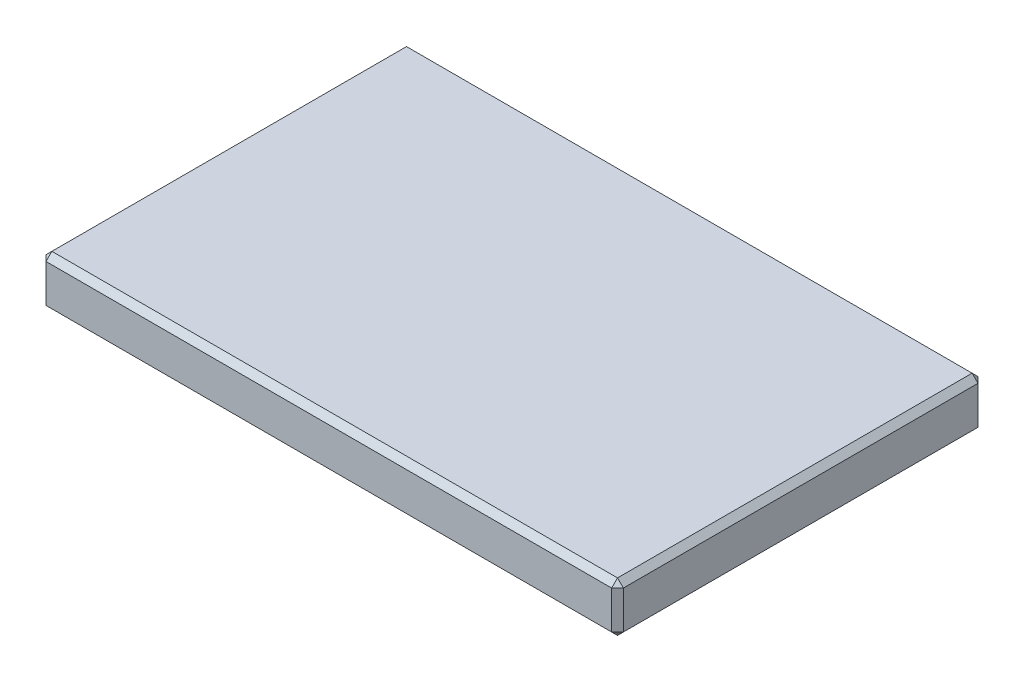
ISO-10303-21;
HEADER;
FILE_DESCRIPTION(('STEP AP214'),'2;1');
FILE_NAME('part.step','',(''),(''),'','','');
FILE_SCHEMA(('AUTOMOTIVE_DESIGN { 1 0 10303 214 1 1 1 1 }'));
ENDSEC;
DATA;
#1=APPLICATION_CONTEXT('core data for automotive mechanical design processes');
#2=APPLICATION_PROTOCOL_DEFINITION('international standard','automotive_design',2000,#1);
#3=PRODUCT_CONTEXT('',#1,'mechanical');
#4=PRODUCT('Part','Part','',(#3));
#5=PRODUCT_RELATED_PRODUCT_CATEGORY('part','',(#4));
#6=PRODUCT_DEFINITION_FORMATION('','',#4);
#7=PRODUCT_DEFINITION_CONTEXT('part definition',#1,'design');
#8=PRODUCT_DEFINITION('design','',#6,#7);
#9=PRODUCT_DEFINITION_SHAPE('','',#8);
#10=(LENGTH_UNIT() NAMED_UNIT(*) SI_UNIT(.MILLI.,.METRE.));
#11=(NAMED_UNIT(*) PLANE_ANGLE_UNIT() SI_UNIT($,.RADIAN.));
#12=(NAMED_UNIT(*) SI_UNIT($,.STERADIAN.) SOLID_ANGLE_UNIT());
#13=UNCERTAINTY_MEASURE_WITH_UNIT(LENGTH_MEASURE(1.E-05),#10,'distance_accuracy_value','');
#14=(GEOMETRIC_REPRESENTATION_CONTEXT(3) GLOBAL_UNCERTAINTY_ASSIGNED_CONTEXT((#13)) GLOBAL_UNIT_ASSIGNED_CONTEXT((#10,
#11,#12)) REPRESENTATION_CONTEXT('',''));
#15=CARTESIAN_POINT('',(0.,0.,0.));
#16=DIRECTION('',(0.,0.,1.));
#17=DIRECTION('',(1.,0.,0.));
#18=AXIS2_PLACEMENT_3D('',#15,#16,#17);
#19=CARTESIAN_POINT('',(98.5,17.,62.5));
#20=DIRECTION('',(-1.,0.,0.));
#21=DIRECTION('',(0.,0.,1.));
#22=AXIS2_PLACEMENT_3D('',#19,#20,#21);
#23=PLANE('',#22);
#24=DIRECTION('',(0.,0.,-1.));
#25=VECTOR('',#24,1.);
#26=CARTESIAN_POINT('',(98.5,1.99999999999997,-62.5));
#27=LINE('',#26,#25);
#28=CARTESIAN_POINT('',(98.5,1.99999999999997,60.5));
#29=VERTEX_POINT('',#28);
#30=CARTESIAN_POINT('',(98.5,1.99999999999997,-60.5));
#31=VERTEX_POINT('',#30);
#32=EDGE_CURVE('E160',#29,#31,#27,.T.);
#33=ORIENTED_EDGE('',*,*,#32,.T.);
#34=DIRECTION('',(0.,1.,0.));
#35=VECTOR('',#34,1.);
#36=CARTESIAN_POINT('',(98.5,17.,-60.5));
#37=LINE('',#36,#35);
#38=CARTESIAN_POINT('',(98.5,15.,-60.5));
#39=VERTEX_POINT('',#38);
#40=EDGE_CURVE('E131',#31,#39,#37,.T.);
#41=ORIENTED_EDGE('',*,*,#40,.T.);
#42=DIRECTION('',(0.,0.,1.));
#43=VECTOR('',#42,1.);
#44=CARTESIAN_POINT('',(98.5,15.,62.5));
#45=LINE('',#44,#43);
#46=CARTESIAN_POINT('',(98.5,15.,60.5));
#47=VERTEX_POINT('',#46);
#48=EDGE_CURVE('E167',#39,#47,#45,.T.);
#49=ORIENTED_EDGE('',*,*,#48,.T.);
#50=DIRECTION('',(0.,-1.,0.));
#51=VECTOR('',#50,1.);
#52=CARTESIAN_POINT('',(98.5,17.,60.5));
#53=LINE('',#52,#51);
#54=EDGE_CURVE('E165',#47,#29,#53,.T.);
#55=ORIENTED_EDGE('',*,*,#54,.T.);
#56=EDGE_LOOP('',(#33,#41,#49,#55));
#57=FACE_BOUND('',#56,.T.);
#58=ADVANCED_FACE('F35',(#57),#23,.F.);
#59=CARTESIAN_POINT('',(-98.5,17.,-62.5));
#60=DIRECTION('',(0.,0.,1.));
#61=DIRECTION('',(1.,0.,0.));
#62=AXIS2_PLACEMENT_3D('',#59,#60,#61);
#63=PLANE('',#62);
#64=DIRECTION('',(0.,1.,0.));
#65=VECTOR('',#64,1.);
#66=CARTESIAN_POINT('',(-96.5,17.,-62.5));
#67=LINE('',#66,#65);
#68=CARTESIAN_POINT('',(-96.5,1.99999999999997,-62.5));
#69=VERTEX_POINT('',#68);
#70=CARTESIAN_POINT('',(-96.5,15.,-62.5));
#71=VERTEX_POINT('',#70);
#72=EDGE_CURVE('E153',#69,#71,#67,.T.);
#73=ORIENTED_EDGE('',*,*,#72,.T.);
#74=DIRECTION('',(1.,0.,0.));
#75=VECTOR('',#74,1.);
#76=CARTESIAN_POINT('',(-98.5,15.,-62.5));
#77=LINE('',#76,#75);
#78=CARTESIAN_POINT('',(96.5,15.,-62.5));
#79=VERTEX_POINT('',#78);
#80=EDGE_CURVE('E157',#71,#79,#77,.T.);
#81=ORIENTED_EDGE('',*,*,#80,.T.);
#82=DIRECTION('',(0.,-1.,0.));
#83=VECTOR('',#82,1.);
#84=CARTESIAN_POINT('',(96.5,17.,-62.5));
#85=LINE('',#84,#83);
#86=CARTESIAN_POINT('',(96.5,1.99999999999997,-62.5));
#87=VERTEX_POINT('',#86);
#88=EDGE_CURVE('E129',#79,#87,#85,.T.);
#89=ORIENTED_EDGE('',*,*,#88,.T.);
#90=DIRECTION('',(-1.,0.,0.));
#91=VECTOR('',#90,1.);
#92=CARTESIAN_POINT('',(-98.5,1.99999999999997,-62.5));
#93=LINE('',#92,#91);
#94=EDGE_CURVE('E147',#87,#69,#93,.T.);
#95=ORIENTED_EDGE('',*,*,#94,.T.);
#96=EDGE_LOOP('',(#73,#81,#89,#95));
#97=FACE_BOUND('',#96,.T.);
#98=ADVANCED_FACE('F155',(#97),#63,.F.);
#99=CARTESIAN_POINT('',(-98.5,17.,62.5));
#100=DIRECTION('',(1.,0.,0.));
#101=DIRECTION('',(0.,0.,-1.));
#102=AXIS2_PLACEMENT_3D('',#99,#100,#101);
#103=PLANE('',#102);
#104=DIRECTION('',(0.,1.,0.));
#105=VECTOR('',#104,1.);
#106=CARTESIAN_POINT('',(-98.5,17.,60.5));
#107=LINE('',#106,#105);
#108=CARTESIAN_POINT('',(-98.5,1.99999999999997,60.5));
#109=VERTEX_POINT('',#108);
#110=CARTESIAN_POINT('',(-98.5,15.,60.5));
#111=VERTEX_POINT('',#110);
#112=EDGE_CURVE('E172',#109,#111,#107,.T.);
#113=ORIENTED_EDGE('',*,*,#112,.T.);
#114=DIRECTION('',(0.,0.,-1.));
#115=VECTOR('',#114,1.);
#116=CARTESIAN_POINT('',(-98.5,15.,62.5));
#117=LINE('',#116,#115);
#118=CARTESIAN_POINT('',(-98.5,15.,-60.5));
#119=VERTEX_POINT('',#118);
#120=EDGE_CURVE('E177',#111,#119,#117,.T.);
#121=ORIENTED_EDGE('',*,*,#120,.T.);
#122=DIRECTION('',(0.,-1.,0.));
#123=VECTOR('',#122,1.);
#124=CARTESIAN_POINT('',(-98.5,17.,-60.5));
#125=LINE('',#124,#123);
#126=CARTESIAN_POINT('',(-98.5,1.99999999999997,-60.5));
#127=VERTEX_POINT('',#126);
#128=EDGE_CURVE('E174',#119,#127,#125,.T.);
#129=ORIENTED_EDGE('',*,*,#128,.T.);
#130=DIRECTION('',(0.,0.,1.));
#131=VECTOR('',#130,1.);
#132=CARTESIAN_POINT('',(-98.5,1.99999999999997,62.5));
#133=LINE('',#132,#131);
#134=EDGE_CURVE('E170',#127,#109,#133,.T.);
#135=ORIENTED_EDGE('',*,*,#134,.T.);
#136=EDGE_LOOP('',(#113,#121,#129,#135));
#137=FACE_BOUND('',#136,.T.);
#138=ADVANCED_FACE('F282',(#137),#103,.F.);
#139=CARTESIAN_POINT('',(-98.5,17.,62.5));
#140=DIRECTION('',(0.,0.,-1.));
#141=DIRECTION('',(-1.,0.,0.));
#142=AXIS2_PLACEMENT_3D('',#139,#140,#141);
#143=PLANE('',#142);
#144=DIRECTION('',(-1.,0.,0.));
#145=VECTOR('',#144,1.);
#146=CARTESIAN_POINT('',(-98.5,15.,62.5));
#147=LINE('',#146,#145);
#148=CARTESIAN_POINT('',(96.5,15.,62.5));
#149=VERTEX_POINT('',#148);
#150=CARTESIAN_POINT('',(-96.5,15.,62.5));
#151=VERTEX_POINT('',#150);
#152=EDGE_CURVE('E183',#149,#151,#147,.T.);
#153=ORIENTED_EDGE('',*,*,#152,.T.);
#154=DIRECTION('',(0.,-1.,0.));
#155=VECTOR('',#154,1.);
#156=CARTESIAN_POINT('',(-96.5,17.,62.5));
#157=LINE('',#156,#155);
#158=CARTESIAN_POINT('',(-96.5,1.99999999999997,62.5));
#159=VERTEX_POINT('',#158);
#160=EDGE_CURVE('E185',#151,#159,#157,.T.);
#161=ORIENTED_EDGE('',*,*,#160,.T.);
#162=DIRECTION('',(1.,0.,0.));
#163=VECTOR('',#162,1.);
#164=CARTESIAN_POINT('',(98.5,1.99999999999997,62.5));
#165=LINE('',#164,#163);
#166=CARTESIAN_POINT('',(96.5,1.99999999999997,62.5));
#167=VERTEX_POINT('',#166);
#168=EDGE_CURVE('E179',#159,#167,#165,.T.);
#169=ORIENTED_EDGE('',*,*,#168,.T.);
#170=DIRECTION('',(0.,1.,0.));
#171=VECTOR('',#170,1.);
#172=CARTESIAN_POINT('',(96.5,17.,62.5));
#173=LINE('',#172,#171);
#174=EDGE_CURVE('E181',#167,#149,#173,.T.);
#175=ORIENTED_EDGE('',*,*,#174,.T.);
#176=EDGE_LOOP('',(#153,#161,#169,#175));
#177=FACE_BOUND('',#176,.T.);
#178=ADVANCED_FACE('F292',(#177),#143,.F.);
#179=CARTESIAN_POINT('',(0.,17.,0.));
#180=DIRECTION('',(0.,-1.,0.));
#181=DIRECTION('',(0.,0.,-1.));
#182=AXIS2_PLACEMENT_3D('',#179,#180,#181);
#183=PLANE('',#182);
#184=DIRECTION('',(0.,0.,1.));
#185=VECTOR('',#184,1.);
#186=CARTESIAN_POINT('',(-96.5,17.,0.));
#187=LINE('',#186,#185);
#188=CARTESIAN_POINT('',(-96.5,17.,-60.5));
#189=VERTEX_POINT('',#188);
#190=CARTESIAN_POINT('',(-96.5,17.,60.5));
#191=VERTEX_POINT('',#190);
#192=EDGE_CURVE('E192',#189,#191,#187,.T.);
#193=ORIENTED_EDGE('',*,*,#192,.T.);
#194=DIRECTION('',(1.,0.,0.));
#195=VECTOR('',#194,1.);
#196=CARTESIAN_POINT('',(0.,17.,60.5));
#197=LINE('',#196,#195);
#198=CARTESIAN_POINT('',(96.5,17.,60.5));
#199=VERTEX_POINT('',#198);
#200=EDGE_CURVE('E194',#191,#199,#197,.T.);
#201=ORIENTED_EDGE('',*,*,#200,.T.);
#202=DIRECTION('',(0.,0.,-1.));
#203=VECTOR('',#202,1.);
#204=CARTESIAN_POINT('',(96.5,17.,0.));
#205=LINE('',#204,#203);
#206=CARTESIAN_POINT('',(96.5,17.,-60.5));
#207=VERTEX_POINT('',#206);
#208=EDGE_CURVE('E188',#199,#207,#205,.T.);
#209=ORIENTED_EDGE('',*,*,#208,.T.);
#210=DIRECTION('',(-1.,0.,0.));
#211=VECTOR('',#210,1.);
#212=CARTESIAN_POINT('',(0.,17.,-60.5));
#213=LINE('',#212,#211);
#214=EDGE_CURVE('E190',#207,#189,#213,.T.);
#215=ORIENTED_EDGE('',*,*,#214,.T.);
#216=EDGE_LOOP('',(#193,#201,#209,#215));
#217=FACE_BOUND('',#216,.T.);
#218=ADVANCED_FACE('F274',(#217),#183,.F.);
#219=CARTESIAN_POINT('',(0.,0.,0.));
#220=DIRECTION('',(0.,-1.,0.));
#221=DIRECTION('',(0.,0.,-1.));
#222=AXIS2_PLACEMENT_3D('',#219,#220,#221);
#223=PLANE('',#222);
#224=DIRECTION('',(0.,0.,1.));
#225=VECTOR('',#224,1.);
#226=CARTESIAN_POINT('',(96.5,0.,62.5));
#227=LINE('',#226,#225);
#228=CARTESIAN_POINT('',(96.5,0.,-60.5));
#229=VERTEX_POINT('',#228);
#230=CARTESIAN_POINT('',(96.5,0.,60.5));
#231=VERTEX_POINT('',#230);
#232=EDGE_CURVE('E197',#229,#231,#227,.T.);
#233=ORIENTED_EDGE('',*,*,#232,.T.);
#234=DIRECTION('',(-1.,0.,0.));
#235=VECTOR('',#234,1.);
#236=CARTESIAN_POINT('',(-98.5,0.,60.5));
#237=LINE('',#236,#235);
#238=CARTESIAN_POINT('',(-96.5,0.,60.5));
#239=VERTEX_POINT('',#238);
#240=EDGE_CURVE('E11',#231,#239,#237,.T.);
#241=ORIENTED_EDGE('',*,*,#240,.T.);
#242=DIRECTION('',(0.,0.,-1.));
#243=VECTOR('',#242,1.);
#244=CARTESIAN_POINT('',(-96.5,0.,-62.5));
#245=LINE('',#244,#243);
#246=CARTESIAN_POINT('',(-96.5,0.,-60.5));
#247=VERTEX_POINT('',#246);
#248=EDGE_CURVE('E45',#239,#247,#245,.T.);
#249=ORIENTED_EDGE('',*,*,#248,.T.);
#250=DIRECTION('',(1.,0.,0.));
#251=VECTOR('',#250,1.);
#252=CARTESIAN_POINT('',(98.5,0.,-60.5));
#253=LINE('',#252,#251);
#254=EDGE_CURVE('E199',#247,#229,#253,.T.);
#255=ORIENTED_EDGE('',*,*,#254,.T.);
#256=EDGE_LOOP('',(#233,#241,#249,#255));
#257=FACE_BOUND('',#256,.T.);
#258=ADVANCED_FACE('F428',(#257),#223,.T.);
#259=CARTESIAN_POINT('',(-96.5,17.,62.5));
#260=DIRECTION('',(0.707106781186547,0.,-0.707106781186547));
#261=DIRECTION('',(0.,-1.,0.));
#262=AXIS2_PLACEMENT_3D('',#259,#260,#261);
#263=PLANE('',#262);
#264=DIRECTION('',(-0.707106781186547,0.,-0.707106781186547));
#265=VECTOR('',#264,1.);
#266=CARTESIAN_POINT('',(-98.5,15.,60.5));
#267=LINE('',#266,#265);
#268=EDGE_CURVE('E40',#111,#151,#267,.F.);
#269=ORIENTED_EDGE('',*,*,#268,.F.);
#270=ORIENTED_EDGE('',*,*,#112,.F.);
#271=DIRECTION('',(0.707106781186547,0.,0.707106781186547));
#272=VECTOR('',#271,1.);
#273=CARTESIAN_POINT('',(-96.5,1.99999999999997,62.5));
#274=LINE('',#273,#272);
#275=EDGE_CURVE('E252',#159,#109,#274,.F.);
#276=ORIENTED_EDGE('',*,*,#275,.F.);
#277=ORIENTED_EDGE('',*,*,#160,.F.);
#278=EDGE_LOOP('',(#269,#270,#276,#277));
#279=FACE_BOUND('',#278,.T.);
#280=ADVANCED_FACE('F38',(#279),#263,.F.);
#281=CARTESIAN_POINT('',(-98.5,15.,60.5));
#282=DIRECTION('',(-0.577350269189626,0.577350269189626,0.577350269189626));
#283=DIRECTION('',(0.707106781186547,0.,0.707106781186547));
#284=AXIS2_PLACEMENT_3D('',#281,#282,#283);
#285=PLANE('',#284);
#286=DIRECTION('',(0.707106781186547,0.707106781186547,0.));
#287=VECTOR('',#286,1.);
#288=CARTESIAN_POINT('',(-98.5,15.,60.5));
#289=LINE('',#288,#287);
#290=EDGE_CURVE('E247',#111,#191,#289,.T.);
#291=ORIENTED_EDGE('',*,*,#290,.F.);
#292=ORIENTED_EDGE('',*,*,#268,.T.);
#293=DIRECTION('',(0.,-0.707106781186547,0.707106781186547));
#294=VECTOR('',#293,1.);
#295=CARTESIAN_POINT('',(-96.5,16.,61.5));
#296=LINE('',#295,#294);
#297=EDGE_CURVE('E250',#191,#151,#296,.T.);
#298=ORIENTED_EDGE('',*,*,#297,.F.);
#299=EDGE_LOOP('',(#291,#292,#298));
#300=FACE_BOUND('',#299,.T.);
#301=ADVANCED_FACE('F262',(#300),#285,.T.);
#302=CARTESIAN_POINT('',(-96.5,1.99999999999997,62.5));
#303=DIRECTION('',(-0.577350269189626,-0.577350269189626,0.577350269189626));
#304=DIRECTION('',(0.707106781186547,0.,0.707106781186547));
#305=AXIS2_PLACEMENT_3D('',#302,#303,#304);
#306=PLANE('',#305);
#307=DIRECTION('',(0.,0.707106781186547,0.707106781186547));
#308=VECTOR('',#307,1.);
#309=CARTESIAN_POINT('',(-96.5,1.99999999999997,62.5));
#310=LINE('',#309,#308);
#311=EDGE_CURVE('E242',#159,#239,#310,.F.);
#312=ORIENTED_EDGE('',*,*,#311,.F.);
#313=ORIENTED_EDGE('',*,*,#275,.T.);
#314=DIRECTION('',(0.707106781186547,-0.707106781186547,0.));
#315=VECTOR('',#314,1.);
#316=CARTESIAN_POINT('',(-97.5,0.999999999999987,60.5));
#317=LINE('',#316,#315);
#318=EDGE_CURVE('E245',#239,#109,#317,.F.);
#319=ORIENTED_EDGE('',*,*,#318,.F.);
#320=EDGE_LOOP('',(#312,#313,#319));
#321=FACE_BOUND('',#320,.T.);
#322=ADVANCED_FACE('F418',(#321),#306,.T.);
#323=CARTESIAN_POINT('',(0.,17.,60.5));
#324=DIRECTION('',(0.,-0.707106781186547,-0.707106781186547));
#325=DIRECTION('',(1.,0.,0.));
#326=AXIS2_PLACEMENT_3D('',#323,#324,#325);
#327=PLANE('',#326);
#328=ORIENTED_EDGE('',*,*,#297,.T.);
#329=ORIENTED_EDGE('',*,*,#152,.F.);
#330=DIRECTION('',(0.,0.707106781186547,-0.707106781186547));
#331=VECTOR('',#330,1.);
#332=CARTESIAN_POINT('',(96.5,17.,60.5));
#333=LINE('',#332,#331);
#334=EDGE_CURVE('E236',#199,#149,#333,.F.);
#335=ORIENTED_EDGE('',*,*,#334,.F.);
#336=ORIENTED_EDGE('',*,*,#200,.F.);
#337=EDGE_LOOP('',(#328,#329,#335,#336));
#338=FACE_BOUND('',#337,.T.);
#339=ADVANCED_FACE('F270',(#338),#327,.F.);
#340=CARTESIAN_POINT('',(-96.5,17.,0.));
#341=DIRECTION('',(0.707106781186547,-0.707106781186547,0.));
#342=DIRECTION('',(0.,0.,1.));
#343=AXIS2_PLACEMENT_3D('',#340,#341,#342);
#344=PLANE('',#343);
#345=ORIENTED_EDGE('',*,*,#290,.T.);
#346=ORIENTED_EDGE('',*,*,#192,.F.);
#347=DIRECTION('',(-0.707106781186547,-0.707106781186547,0.));
#348=VECTOR('',#347,1.);
#349=CARTESIAN_POINT('',(-97.5,16.,-60.5));
#350=LINE('',#349,#348);
#351=EDGE_CURVE('E233',#119,#189,#350,.F.);
#352=ORIENTED_EDGE('',*,*,#351,.F.);
#353=ORIENTED_EDGE('',*,*,#120,.F.);
#354=EDGE_LOOP('',(#345,#346,#352,#353));
#355=FACE_BOUND('',#354,.T.);
#356=ADVANCED_FACE('F279',(#355),#344,.F.);
#357=CARTESIAN_POINT('',(-98.5,17.,-60.5));
#358=DIRECTION('',(0.707106781186547,0.,0.707106781186547));
#359=DIRECTION('',(0.,-1.,0.));
#360=AXIS2_PLACEMENT_3D('',#357,#358,#359);
#361=PLANE('',#360);
#362=DIRECTION('',(-0.707106781186547,0.,0.707106781186547));
#363=VECTOR('',#362,1.);
#364=CARTESIAN_POINT('',(-98.5,1.99999999999997,-60.5));
#365=LINE('',#364,#363);
#366=EDGE_CURVE('E227',#127,#69,#365,.F.);
#367=ORIENTED_EDGE('',*,*,#366,.F.);
#368=ORIENTED_EDGE('',*,*,#128,.F.);
#369=DIRECTION('',(0.707106781186547,0.,-0.707106781186547));
#370=VECTOR('',#369,1.);
#371=CARTESIAN_POINT('',(-96.5,15.,-62.5));
#372=LINE('',#371,#370);
#373=EDGE_CURVE('E230',#71,#119,#372,.F.);
#374=ORIENTED_EDGE('',*,*,#373,.F.);
#375=ORIENTED_EDGE('',*,*,#72,.F.);
#376=EDGE_LOOP('',(#367,#368,#374,#375));
#377=FACE_BOUND('',#376,.T.);
#378=ADVANCED_FACE('F286',(#377),#361,.F.);
#379=CARTESIAN_POINT('',(-98.5,1.99999999999997,62.5));
#380=DIRECTION('',(-0.707106781186547,-0.707106781186547,0.));
#381=DIRECTION('',(0.,0.,-1.));
#382=AXIS2_PLACEMENT_3D('',#379,#380,#381);
#383=PLANE('',#382);
#384=ORIENTED_EDGE('',*,*,#318,.T.);
#385=ORIENTED_EDGE('',*,*,#134,.F.);
#386=DIRECTION('',(-0.707106781186547,0.707106781186547,0.));
#387=VECTOR('',#386,1.);
#388=CARTESIAN_POINT('',(-98.5,1.99999999999997,-60.5));
#389=LINE('',#388,#387);
#390=EDGE_CURVE('E225',#247,#127,#389,.T.);
#391=ORIENTED_EDGE('',*,*,#390,.F.);
#392=ORIENTED_EDGE('',*,*,#248,.F.);
#393=EDGE_LOOP('',(#384,#385,#391,#392));
#394=FACE_BOUND('',#393,.T.);
#395=ADVANCED_FACE('F290',(#394),#383,.T.);
#396=CARTESIAN_POINT('',(-98.5,1.99999999999997,62.5));
#397=DIRECTION('',(0.,-0.707106781186547,0.707106781186547));
#398=DIRECTION('',(-1.,0.,0.));
#399=AXIS2_PLACEMENT_3D('',#396,#397,#398);
#400=PLANE('',#399);
#401=ORIENTED_EDGE('',*,*,#311,.T.);
#402=ORIENTED_EDGE('',*,*,#240,.F.);
#403=DIRECTION('',(0.,-0.707106781186547,-0.707106781186547));
#404=VECTOR('',#403,1.);
#405=CARTESIAN_POINT('',(96.5,0.999999999999987,61.5));
#406=LINE('',#405,#404);
#407=EDGE_CURVE('E222',#167,#231,#406,.T.);
#408=ORIENTED_EDGE('',*,*,#407,.F.);
#409=ORIENTED_EDGE('',*,*,#168,.F.);
#410=EDGE_LOOP('',(#401,#402,#408,#409));
#411=FACE_BOUND('',#410,.T.);
#412=ADVANCED_FACE('F302',(#411),#400,.T.);
#413=CARTESIAN_POINT('',(98.5,17.,60.5));
#414=DIRECTION('',(-0.707106781186547,0.,-0.707106781186547));
#415=DIRECTION('',(0.,-1.,0.));
#416=AXIS2_PLACEMENT_3D('',#413,#414,#415);
#417=PLANE('',#416);
#418=DIRECTION('',(-0.707106781186547,0.,0.707106781186547));
#419=VECTOR('',#418,1.);
#420=CARTESIAN_POINT('',(97.5,15.,61.5));
#421=LINE('',#420,#419);
#422=EDGE_CURVE('E239',#149,#47,#421,.F.);
#423=ORIENTED_EDGE('',*,*,#422,.F.);
#424=ORIENTED_EDGE('',*,*,#174,.F.);
#425=DIRECTION('',(0.707106781186547,0.,-0.707106781186547));
#426=VECTOR('',#425,1.);
#427=CARTESIAN_POINT('',(98.5,1.99999999999997,60.5));
#428=LINE('',#427,#426);
#429=EDGE_CURVE('E219',#29,#167,#428,.F.);
#430=ORIENTED_EDGE('',*,*,#429,.F.);
#431=ORIENTED_EDGE('',*,*,#54,.F.);
#432=EDGE_LOOP('',(#423,#424,#430,#431));
#433=FACE_BOUND('',#432,.T.);
#434=ADVANCED_FACE('F297',(#433),#417,.F.);
#435=CARTESIAN_POINT('',(96.5,17.,60.5));
#436=DIRECTION('',(0.577350269189626,0.577350269189626,0.577350269189626));
#437=DIRECTION('',(0.707106781186547,0.,-0.707106781186547));
#438=AXIS2_PLACEMENT_3D('',#435,#436,#437);
#439=PLANE('',#438);
#440=ORIENTED_EDGE('',*,*,#334,.T.);
#441=ORIENTED_EDGE('',*,*,#422,.T.);
#442=DIRECTION('',(0.707106781186547,-0.707106781186547,0.));
#443=VECTOR('',#442,1.);
#444=CARTESIAN_POINT('',(96.5,17.,60.5));
#445=LINE('',#444,#443);
#446=EDGE_CURVE('E216',#199,#47,#445,.T.);
#447=ORIENTED_EDGE('',*,*,#446,.F.);
#448=EDGE_LOOP('',(#440,#441,#447));
#449=FACE_BOUND('',#448,.T.);
#450=ADVANCED_FACE('F313',(#449),#439,.T.);
#451=CARTESIAN_POINT('',(-96.5,15.,-62.5));
#452=DIRECTION('',(-0.577350269189626,0.577350269189626,-0.577350269189626));
#453=DIRECTION('',(-0.707106781186547,0.,0.707106781186547));
#454=AXIS2_PLACEMENT_3D('',#451,#452,#453);
#455=PLANE('',#454);
#456=ORIENTED_EDGE('',*,*,#373,.T.);
#457=ORIENTED_EDGE('',*,*,#351,.T.);
#458=DIRECTION('',(0.,0.707106781186547,0.707106781186547));
#459=VECTOR('',#458,1.);
#460=CARTESIAN_POINT('',(-96.5,15.,-62.5));
#461=LINE('',#460,#459);
#462=EDGE_CURVE('E213',#71,#189,#461,.T.);
#463=ORIENTED_EDGE('',*,*,#462,.F.);
#464=EDGE_LOOP('',(#456,#457,#463));
#465=FACE_BOUND('',#464,.T.);
#466=ADVANCED_FACE('F323',(#465),#455,.T.);
#467=CARTESIAN_POINT('',(-98.5,1.99999999999997,-60.5));
#468=DIRECTION('',(-0.577350269189626,-0.577350269189626,-0.577350269189626));
#469=DIRECTION('',(-0.707106781186547,0.,0.707106781186547));
#470=AXIS2_PLACEMENT_3D('',#467,#468,#469);
#471=PLANE('',#470);
#472=ORIENTED_EDGE('',*,*,#390,.T.);
#473=ORIENTED_EDGE('',*,*,#366,.T.);
#474=DIRECTION('',(0.,-0.707106781186547,0.707106781186547));
#475=VECTOR('',#474,1.);
#476=CARTESIAN_POINT('',(-96.5,0.999999999999987,-61.5));
#477=LINE('',#476,#475);
#478=EDGE_CURVE('E150',#247,#69,#477,.F.);
#479=ORIENTED_EDGE('',*,*,#478,.F.);
#480=EDGE_LOOP('',(#472,#473,#479));
#481=FACE_BOUND('',#480,.T.);
#482=ADVANCED_FACE('F325',(#481),#471,.T.);
#483=CARTESIAN_POINT('',(98.5,1.99999999999997,60.5));
#484=DIRECTION('',(0.577350269189626,-0.577350269189626,0.577350269189626));
#485=DIRECTION('',(0.707106781186547,0.,-0.707106781186547));
#486=AXIS2_PLACEMENT_3D('',#483,#484,#485);
#487=PLANE('',#486);
#488=ORIENTED_EDGE('',*,*,#429,.T.);
#489=ORIENTED_EDGE('',*,*,#407,.T.);
#490=DIRECTION('',(0.707106781186547,0.707106781186547,0.));
#491=VECTOR('',#490,1.);
#492=CARTESIAN_POINT('',(98.5,1.99999999999997,60.5));
#493=LINE('',#492,#491);
#494=EDGE_CURVE('E209',#29,#231,#493,.F.);
#495=ORIENTED_EDGE('',*,*,#494,.F.);
#496=EDGE_LOOP('',(#488,#489,#495));
#497=FACE_BOUND('',#496,.T.);
#498=ADVANCED_FACE('F304',(#497),#487,.T.);
#499=CARTESIAN_POINT('',(96.5,17.,0.));
#500=DIRECTION('',(-0.707106781186547,-0.707106781186547,0.));
#501=DIRECTION('',(0.,0.,-1.));
#502=AXIS2_PLACEMENT_3D('',#499,#500,#501);
#503=PLANE('',#502);
#504=ORIENTED_EDGE('',*,*,#446,.T.);
#505=ORIENTED_EDGE('',*,*,#48,.F.);
#506=DIRECTION('',(-0.707106781186547,0.707106781186547,0.));
#507=VECTOR('',#506,1.);
#508=CARTESIAN_POINT('',(98.5,15.,-60.5));
#509=LINE('',#508,#507);
#510=EDGE_CURVE('E206',#207,#39,#509,.F.);
#511=ORIENTED_EDGE('',*,*,#510,.F.);
#512=ORIENTED_EDGE('',*,*,#208,.F.);
#513=EDGE_LOOP('',(#504,#505,#511,#512));
#514=FACE_BOUND('',#513,.T.);
#515=ADVANCED_FACE('F315',(#514),#503,.F.);
#516=CARTESIAN_POINT('',(0.,17.,-60.5));
#517=DIRECTION('',(0.,-0.707106781186547,0.707106781186547));
#518=DIRECTION('',(-1.,0.,0.));
#519=AXIS2_PLACEMENT_3D('',#516,#517,#518);
#520=PLANE('',#519);
#521=ORIENTED_EDGE('',*,*,#462,.T.);
#522=ORIENTED_EDGE('',*,*,#214,.F.);
#523=DIRECTION('',(0.,-0.707106781186547,-0.707106781186547));
#524=VECTOR('',#523,1.);
#525=CARTESIAN_POINT('',(96.5,16.,-61.5));
#526=LINE('',#525,#524);
#527=EDGE_CURVE('E144',#79,#207,#526,.F.);
#528=ORIENTED_EDGE('',*,*,#527,.F.);
#529=ORIENTED_EDGE('',*,*,#80,.F.);
#530=EDGE_LOOP('',(#521,#522,#528,#529));
#531=FACE_BOUND('',#530,.T.);
#532=ADVANCED_FACE('F321',(#531),#520,.F.);
#533=CARTESIAN_POINT('',(-98.5,1.99999999999997,-62.5));
#534=DIRECTION('',(0.,-0.707106781186547,-0.707106781186547));
#535=DIRECTION('',(1.,0.,0.));
#536=AXIS2_PLACEMENT_3D('',#533,#534,#535);
#537=PLANE('',#536);
#538=ORIENTED_EDGE('',*,*,#478,.T.);
#539=ORIENTED_EDGE('',*,*,#94,.F.);
#540=DIRECTION('',(0.,0.707106781186547,-0.707106781186547));
#541=VECTOR('',#540,1.);
#542=CARTESIAN_POINT('',(96.5,1.99999999999997,-62.5));
#543=LINE('',#542,#541);
#544=EDGE_CURVE('E137',#229,#87,#543,.T.);
#545=ORIENTED_EDGE('',*,*,#544,.F.);
#546=ORIENTED_EDGE('',*,*,#254,.F.);
#547=EDGE_LOOP('',(#538,#539,#545,#546));
#548=FACE_BOUND('',#547,.T.);
#549=ADVANCED_FACE('F148',(#548),#537,.T.);
#550=CARTESIAN_POINT('',(98.5,1.99999999999997,62.5));
#551=DIRECTION('',(0.707106781186547,-0.707106781186547,0.));
#552=DIRECTION('',(0.,0.,1.));
#553=AXIS2_PLACEMENT_3D('',#550,#551,#552);
#554=PLANE('',#553);
#555=ORIENTED_EDGE('',*,*,#494,.T.);
#556=ORIENTED_EDGE('',*,*,#232,.F.);
#557=DIRECTION('',(-0.707106781186547,-0.707106781186547,0.));
#558=VECTOR('',#557,1.);
#559=CARTESIAN_POINT('',(97.5,0.999999999999987,-60.5));
#560=LINE('',#559,#558);
#561=EDGE_CURVE('E141',#31,#229,#560,.T.);
#562=ORIENTED_EDGE('',*,*,#561,.F.);
#563=ORIENTED_EDGE('',*,*,#32,.F.);
#564=EDGE_LOOP('',(#555,#556,#562,#563));
#565=FACE_BOUND('',#564,.T.);
#566=ADVANCED_FACE('F308',(#565),#554,.T.);
#567=CARTESIAN_POINT('',(98.5,15.,-60.5));
#568=DIRECTION('',(0.577350269189626,0.577350269189626,-0.577350269189626));
#569=DIRECTION('',(-0.707106781186547,0.,-0.707106781186547));
#570=AXIS2_PLACEMENT_3D('',#567,#568,#569);
#571=PLANE('',#570);
#572=ORIENTED_EDGE('',*,*,#527,.T.);
#573=ORIENTED_EDGE('',*,*,#510,.T.);
#574=DIRECTION('',(0.707106781186547,0.,0.707106781186547));
#575=VECTOR('',#574,1.);
#576=CARTESIAN_POINT('',(98.5,15.,-60.5));
#577=LINE('',#576,#575);
#578=EDGE_CURVE('E134',#79,#39,#577,.T.);
#579=ORIENTED_EDGE('',*,*,#578,.F.);
#580=EDGE_LOOP('',(#572,#573,#579));
#581=FACE_BOUND('',#580,.T.);
#582=ADVANCED_FACE('F319',(#581),#571,.T.);
#583=CARTESIAN_POINT('',(96.5,1.99999999999997,-62.5));
#584=DIRECTION('',(0.577350269189626,-0.577350269189626,-0.577350269189626));
#585=DIRECTION('',(-0.707106781186547,0.,-0.707106781186547));
#586=AXIS2_PLACEMENT_3D('',#583,#584,#585);
#587=PLANE('',#586);
#588=ORIENTED_EDGE('',*,*,#561,.T.);
#589=ORIENTED_EDGE('',*,*,#544,.T.);
#590=DIRECTION('',(-0.707106781186547,0.,-0.707106781186547));
#591=VECTOR('',#590,1.);
#592=CARTESIAN_POINT('',(96.5,1.99999999999997,-62.5));
#593=LINE('',#592,#591);
#594=EDGE_CURVE('E125',#31,#87,#593,.T.);
#595=ORIENTED_EDGE('',*,*,#594,.F.);
#596=EDGE_LOOP('',(#588,#589,#595));
#597=FACE_BOUND('',#596,.T.);
#598=ADVANCED_FACE('F139',(#597),#587,.T.);
#599=CARTESIAN_POINT('',(96.5,17.,-62.5));
#600=DIRECTION('',(-0.707106781186547,0.,0.707106781186547));
#601=DIRECTION('',(0.,-1.,0.));
#602=AXIS2_PLACEMENT_3D('',#599,#600,#601);
#603=PLANE('',#602);
#604=ORIENTED_EDGE('',*,*,#578,.T.);
#605=ORIENTED_EDGE('',*,*,#40,.F.);
#606=ORIENTED_EDGE('',*,*,#594,.T.);
#607=ORIENTED_EDGE('',*,*,#88,.F.);
#608=EDGE_LOOP('',(#604,#605,#606,#607));
#609=FACE_BOUND('',#608,.T.);
#610=ADVANCED_FACE('F127',(#609),#603,.F.);
#611=CLOSED_SHELL('',(#58,#98,#138,#178,#218,#258,#280,#301,#322,#339,#356,#378,#395,#412,#434,
#450,#466,#482,#498,#515,#532,#549,#566,#582,#598,#610));
#612=MANIFOLD_SOLID_BREP('B2',#611);
#613=ADVANCED_BREP_SHAPE_REPRESENTATION('',(#18,#612),#14);
#614=SHAPE_DEFINITION_REPRESENTATION(#9,#613);
ENDSEC;
END-ISO-10303-21;
